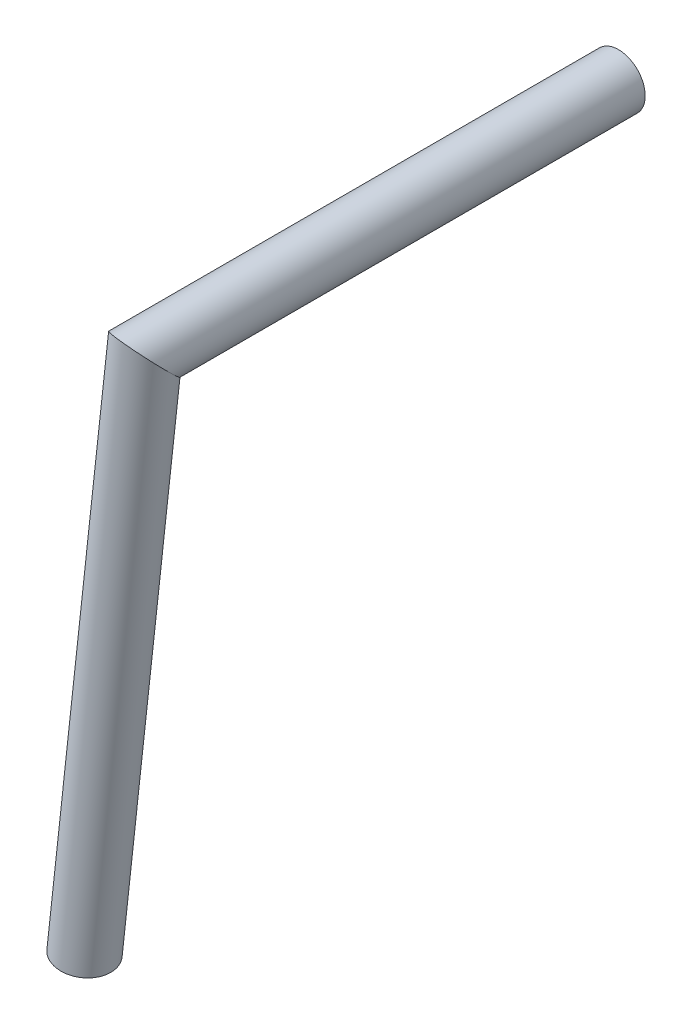
ISO-10303-21;
HEADER;
FILE_DESCRIPTION(('STEP AP214'),'2;1');
FILE_NAME('part.step','',(''),(''),'','','');
FILE_SCHEMA(('AUTOMOTIVE_DESIGN { 1 0 10303 214 1 1 1 1 }'));
ENDSEC;
DATA;
#1=APPLICATION_CONTEXT('core data for automotive mechanical design processes');
#2=APPLICATION_PROTOCOL_DEFINITION('international standard','automotive_design',2000,#1);
#3=PRODUCT_CONTEXT('',#1,'mechanical');
#4=PRODUCT('Part','Part','',(#3));
#5=PRODUCT_RELATED_PRODUCT_CATEGORY('part','',(#4));
#6=PRODUCT_DEFINITION_FORMATION('','',#4);
#7=PRODUCT_DEFINITION_CONTEXT('part definition',#1,'design');
#8=PRODUCT_DEFINITION('design','',#6,#7);
#9=PRODUCT_DEFINITION_SHAPE('','',#8);
#10=(LENGTH_UNIT() NAMED_UNIT(*) SI_UNIT(.MILLI.,.METRE.));
#11=(NAMED_UNIT(*) PLANE_ANGLE_UNIT() SI_UNIT($,.RADIAN.));
#12=(NAMED_UNIT(*) SI_UNIT($,.STERADIAN.) SOLID_ANGLE_UNIT());
#13=UNCERTAINTY_MEASURE_WITH_UNIT(LENGTH_MEASURE(1.E-05),#10,'distance_accuracy_value','');
#14=(GEOMETRIC_REPRESENTATION_CONTEXT(3) GLOBAL_UNCERTAINTY_ASSIGNED_CONTEXT((#13)) GLOBAL_UNIT_ASSIGNED_CONTEXT((#10,
#11,#12)) REPRESENTATION_CONTEXT('',''));
#15=CARTESIAN_POINT('',(0.,0.,0.));
#16=DIRECTION('',(0.,0.,1.));
#17=DIRECTION('',(1.,0.,0.));
#18=AXIS2_PLACEMENT_3D('',#15,#16,#17);
#19=CARTESIAN_POINT('',(-7.49402826635449,-62.0613063622367,52.1046892013867));
#20=DIRECTION('',(-0.119870881289455,-0.992702885978715,-0.0131130464965301));
#21=DIRECTION('',(0.98544004647128,-0.12057730561582,0.119870881289455));
#22=AXIS2_PLACEMENT_3D('',#19,#20,#21);
#23=PLANE('',#22);
#24=CARTESIAN_POINT('',(-7.49402826635449,-62.0613063622367,52.1046892013867));
#25=DIRECTION('',(-0.119870881289455,-0.992702885978715,-0.0131130464965301));
#26=DIRECTION('',(0.98544004647128,-0.12057730561582,0.119870881289455));
#27=AXIS2_PLACEMENT_3D('',#24,#25,#26);
#28=CIRCLE('',#27,2.98360907132551);
#29=CARTESIAN_POINT('',(-4.55386040445535,-62.421061905068,52.4623370501897));
#30=VERTEX_POINT('',#29);
#31=EDGE_CURVE('E34',#30,#30,#28,.T.);
#32=ORIENTED_EDGE('',*,*,#31,.T.);
#33=EDGE_LOOP('',(#32));
#34=FACE_BOUND('',#33,.T.);
#35=ADVANCED_FACE('F31',(#34),#23,.T.);
#36=CARTESIAN_POINT('',(0.,0.,0.));
#37=DIRECTION('',(0.,0.,1.));
#38=DIRECTION('',(1.,0.,0.));
#39=AXIS2_PLACEMENT_3D('',#36,#37,#38);
#40=PLANE('',#39);
#41=CARTESIAN_POINT('',(0.,0.,0.));
#42=DIRECTION('',(0.,0.,1.));
#43=DIRECTION('',(1.,0.,0.));
#44=AXIS2_PLACEMENT_3D('',#41,#42,#43);
#45=CIRCLE('',#44,2.98360907132551);
#46=CARTESIAN_POINT('',(2.98360907132551,0.,0.));
#47=VERTEX_POINT('',#46);
#48=EDGE_CURVE('E38',#47,#47,#45,.T.);
#49=ORIENTED_EDGE('',*,*,#48,.F.);
#50=EDGE_LOOP('',(#49));
#51=FACE_BOUND('',#50,.T.);
#52=ADVANCED_FACE('F52',(#51),#40,.F.);
#53=CARTESIAN_POINT('',(0.851234612726918,7.04944393174594,53.0176033218303));
#54=DIRECTION('',(-0.119870881289455,-0.992702885978715,-0.0131130464965302));
#55=DIRECTION('',(0.992788245604768,-0.119881188636946,0.));
#56=AXIS2_PLACEMENT_3D('',#53,#54,#55);
#57=CYLINDRICAL_SURFACE('',#56,2.98360907132551);
#58=CARTESIAN_POINT('',(0.,0.,52.9244841344507));
#59=DIRECTION('',(-0.085322779867747,-0.706595037120913,0.702455320110635));
#60=DIRECTION('',(0.0842111787392096,0.697389384868373,0.711727843524662));
#61=AXIS2_PLACEMENT_3D('',#58,#59,#60);
#62=ELLIPSE('',#61,4.24740049068971,2.98360907132551);
#63=CARTESIAN_POINT('',(0.357678601898478,2.96209201549173,55.9474773262749));
#64=VERTEX_POINT('',#63);
#65=EDGE_CURVE('E10',#64,#64,#62,.F.);
#66=ORIENTED_EDGE('',*,*,#65,.F.);
#67=EDGE_LOOP('',(#66));
#68=FACE_BOUND('',#67,.T.);
#69=ORIENTED_EDGE('',*,*,#31,.F.);
#70=EDGE_LOOP('',(#69));
#71=FACE_BOUND('',#70,.T.);
#72=ADVANCED_FACE('F49',(#68,#71),#57,.T.);
#73=CARTESIAN_POINT('',(0.,0.,0.));
#74=DIRECTION('',(0.,0.,1.));
#75=DIRECTION('',(1.,0.,0.));
#76=AXIS2_PLACEMENT_3D('',#73,#74,#75);
#77=CYLINDRICAL_SURFACE('',#76,2.98360907132551);
#78=ORIENTED_EDGE('',*,*,#48,.T.);
#79=EDGE_LOOP('',(#78));
#80=FACE_BOUND('',#79,.T.);
#81=ORIENTED_EDGE('',*,*,#65,.T.);
#82=EDGE_LOOP('',(#81));
#83=FACE_BOUND('',#82,.T.);
#84=ADVANCED_FACE('F51',(#80,#83),#77,.T.);
#85=CLOSED_SHELL('',(#35,#52,#72,#84));
#86=MANIFOLD_SOLID_BREP('B2',#85);
#87=ADVANCED_BREP_SHAPE_REPRESENTATION('',(#18,#86),#14);
#88=SHAPE_DEFINITION_REPRESENTATION(#9,#87);
ENDSEC;
END-ISO-10303-21;
